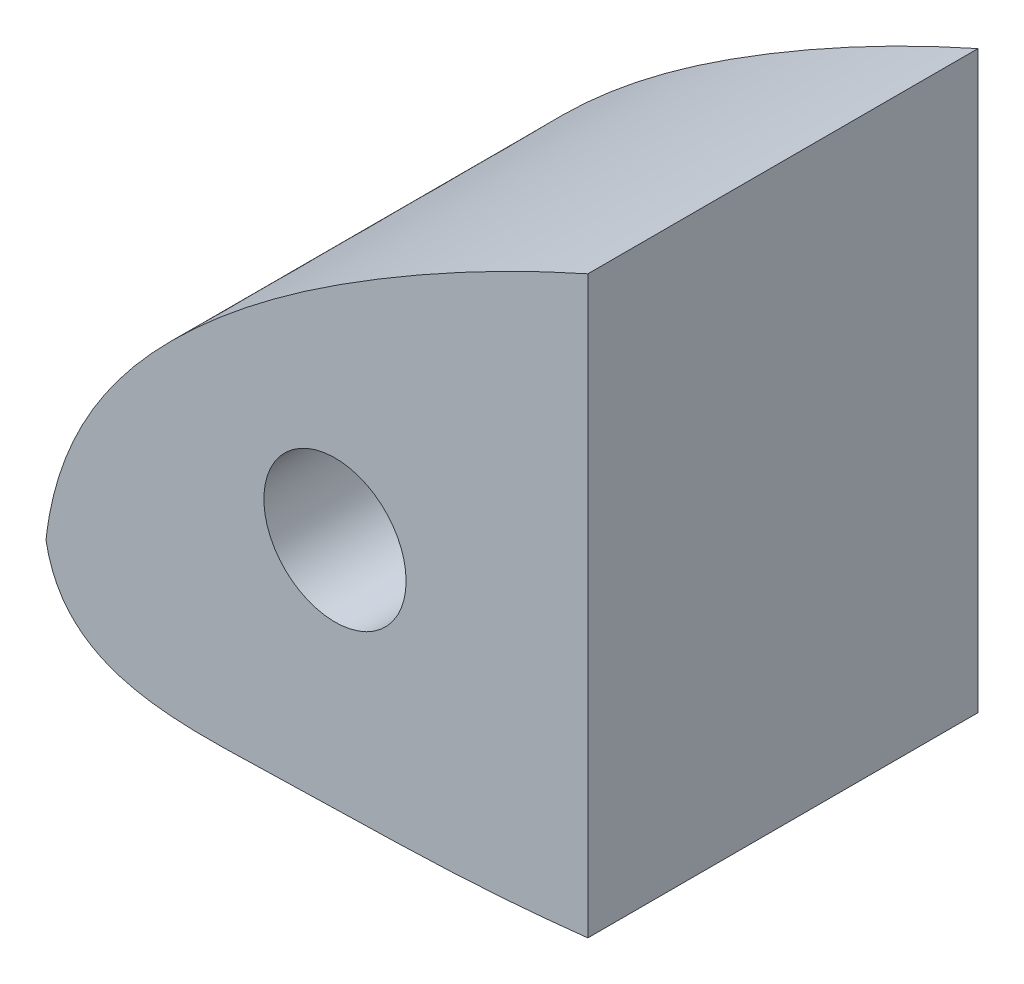
ISO-10303-21;
HEADER;
FILE_DESCRIPTION(('STEP AP214'),'2;1');
FILE_NAME('part.step','',(''),(''),'','','');
FILE_SCHEMA(('AUTOMOTIVE_DESIGN { 1 0 10303 214 1 1 1 1 }'));
ENDSEC;
DATA;
#1=APPLICATION_CONTEXT('core data for automotive mechanical design processes');
#2=APPLICATION_PROTOCOL_DEFINITION('international standard','automotive_design',2000,#1);
#3=PRODUCT_CONTEXT('',#1,'mechanical');
#4=PRODUCT('Part','Part','',(#3));
#5=PRODUCT_RELATED_PRODUCT_CATEGORY('part','',(#4));
#6=PRODUCT_DEFINITION_FORMATION('','',#4);
#7=PRODUCT_DEFINITION_CONTEXT('part definition',#1,'design');
#8=PRODUCT_DEFINITION('design','',#6,#7);
#9=PRODUCT_DEFINITION_SHAPE('','',#8);
#10=(LENGTH_UNIT() NAMED_UNIT(*) SI_UNIT(.MILLI.,.METRE.));
#11=(NAMED_UNIT(*) PLANE_ANGLE_UNIT() SI_UNIT($,.RADIAN.));
#12=(NAMED_UNIT(*) SI_UNIT($,.STERADIAN.) SOLID_ANGLE_UNIT());
#13=UNCERTAINTY_MEASURE_WITH_UNIT(LENGTH_MEASURE(1.E-05),#10,'distance_accuracy_value','');
#14=(GEOMETRIC_REPRESENTATION_CONTEXT(3) GLOBAL_UNCERTAINTY_ASSIGNED_CONTEXT((#13)) GLOBAL_UNIT_ASSIGNED_CONTEXT((#10,
#11,#12)) REPRESENTATION_CONTEXT('',''));
#15=CARTESIAN_POINT('',(0.,0.,0.));
#16=DIRECTION('',(0.,0.,1.));
#17=DIRECTION('',(1.,0.,0.));
#18=AXIS2_PLACEMENT_3D('',#15,#16,#17);
#19=CARTESIAN_POINT('',(0.000560351162113587,0.000130087070423624,27.432));
#20=CARTESIAN_POINT('',(1.23071418869678,-6.92407609127206,27.432));
#21=CARTESIAN_POINT('',(15.3166033306834,-6.18906584099094,27.432));
#22=CARTESIAN_POINT('',(36.4546728163185,-6.09849990105009,27.432));
#23=CARTESIAN_POINT('',(66.5061971849192,-0.586669106973501,27.432));
#24=CARTESIAN_POINT('',(110.497331171581,6.18149522271792,27.432));
#25=CARTESIAN_POINT('',(157.718638091679,9.03065014873911,27.432));
#26=CARTESIAN_POINT('',(205.10142463584,8.83808028186313,27.432));
#27=CARTESIAN_POINT('',(235.858814759408,7.87030619247826,27.432));
#28=CARTESIAN_POINT('',(260.846344817159,5.42741339404395,27.432));
#29=CARTESIAN_POINT('',(276.264022989737,4.51435670375389,27.432));
#30=CARTESIAN_POINT('',(293.989507544058,2.09398731346533,27.432));
#31=CARTESIAN_POINT('',(303.956832564589,1.47095520994628,27.432));
#32=CARTESIAN_POINT('',(309.846313894505,0.000130087070423666,27.432));
#33=B_SPLINE_CURVE_WITH_KNOTS('',3,(#19,#20,#21,#22,#23,#24,#25,#26,#27,#28,#29,#30,#31,#32),
.UNSPECIFIED.,.F.,.F.,(4,1,1,1,1,1,1,1,1,1,1,4),(0.,0.0569078595717698,0.106482711504673,
0.214488052979465,0.341297688349143,0.535095665520157,0.664680853556909,0.794660698192775,
0.828978881532905,0.904725108725214,0.942212919019968,1.),.UNSPECIFIED.);
#34=DIRECTION('',(0.,0.,-1.));
#35=VECTOR('',#34,1.);
#36=SURFACE_OF_LINEAR_EXTRUSION('',#33,#35);
#37=CARTESIAN_POINT('',(0.000560351162113587,0.000130087070423624,0.));
#38=CARTESIAN_POINT('',(1.23071418869678,-6.92407609127206,0.));
#39=CARTESIAN_POINT('',(15.3166033306834,-6.18906584099094,0.));
#40=CARTESIAN_POINT('',(36.4546728163185,-6.09849990105009,0.));
#41=CARTESIAN_POINT('',(66.5061971849192,-0.586669106973501,0.));
#42=CARTESIAN_POINT('',(110.497331171581,6.18149522271792,0.));
#43=CARTESIAN_POINT('',(157.718638091679,9.03065014873911,0.));
#44=CARTESIAN_POINT('',(205.10142463584,8.83808028186313,0.));
#45=CARTESIAN_POINT('',(235.858814759408,7.87030619247826,0.));
#46=CARTESIAN_POINT('',(260.846344817159,5.42741339404395,0.));
#47=CARTESIAN_POINT('',(276.264022989737,4.51435670375389,0.));
#48=CARTESIAN_POINT('',(293.989507544058,2.09398731346533,0.));
#49=CARTESIAN_POINT('',(303.956832564589,1.47095520994628,0.));
#50=CARTESIAN_POINT('',(309.846313894505,0.000130087070423666,0.));
#51=B_SPLINE_CURVE_WITH_KNOTS('',3,(#37,#38,#39,#40,#41,#42,#43,#44,#45,#46,#47,#48,#49,#50),
.UNSPECIFIED.,.F.,.F.,(4,1,1,1,1,1,1,1,1,1,1,4),(0.,0.0569078595717698,0.106482711504673,
0.214488052979465,0.341297688349143,0.535095665520157,0.664680853556909,0.794660698192775,
0.828978881532905,0.904725108725214,0.942212919019968,1.),.UNSPECIFIED.);
#52=CARTESIAN_POINT('',(0.000560351162116727,0.000130087070423829,0.));
#53=VERTEX_POINT('',#52);
#54=CARTESIAN_POINT('',(38.0999999979874,-5.18097252426853,0.));
#55=VERTEX_POINT('',#54);
#56=EDGE_CURVE('E100',#53,#55,#51,.T.);
#57=ORIENTED_EDGE('',*,*,#56,.T.);
#58=DIRECTION('',(0.,0.,-1.));
#59=VECTOR('',#58,1.);
#60=CARTESIAN_POINT('',(38.1,-5.18097252404465,27.432));
#61=LINE('',#60,#59);
#62=CARTESIAN_POINT('',(38.1,-5.18097252426854,27.432));
#63=VERTEX_POINT('',#62);
#64=EDGE_CURVE('E55',#55,#63,#61,.F.);
#65=ORIENTED_EDGE('',*,*,#64,.T.);
#66=CARTESIAN_POINT('',(0.000560351162116727,0.000130087070423829,27.432));
#67=VERTEX_POINT('',#66);
#68=EDGE_CURVE('E84',#67,#63,#33,.T.);
#69=ORIENTED_EDGE('',*,*,#68,.F.);
#70=DIRECTION('',(0.,0.,-1.));
#71=VECTOR('',#70,1.);
#72=CARTESIAN_POINT('',(0.000560351162116727,0.000130087070423829,27.432));
#73=LINE('',#72,#71);
#74=EDGE_CURVE('E11',#67,#53,#73,.T.);
#75=ORIENTED_EDGE('',*,*,#74,.T.);
#76=EDGE_LOOP('',(#57,#65,#69,#75));
#77=FACE_BOUND('',#76,.T.);
#78=ADVANCED_FACE('F39',(#77),#36,.F.);
#79=CARTESIAN_POINT('',(309.846313894505,0.000130087070423864,27.432));
#80=CARTESIAN_POINT('',(314.816918223261,-0.51620674157964,27.432));
#81=CARTESIAN_POINT('',(301.273197720551,4.38282813873556,27.432));
#82=CARTESIAN_POINT('',(290.359837670022,8.71099439045776,27.432));
#83=CARTESIAN_POINT('',(256.952064400645,19.5289209482833,27.432));
#84=CARTESIAN_POINT('',(217.961060472083,29.6129748944238,27.432));
#85=CARTESIAN_POINT('',(173.256699242147,40.0411042779434,27.432));
#86=CARTESIAN_POINT('',(131.400792108858,47.8848319151037,27.432));
#87=CARTESIAN_POINT('',(89.5976184754884,49.290763053775,27.432));
#88=CARTESIAN_POINT('',(52.1111282710831,42.0692152748914,27.432));
#89=CARTESIAN_POINT('',(26.2867198183782,29.9751763284633,27.432));
#90=CARTESIAN_POINT('',(8.64909202481883,17.8566051741579,27.432));
#91=CARTESIAN_POINT('',(0.810633126632263,7.35919605469637,27.432));
#92=CARTESIAN_POINT('',(0.000560351162116727,0.000130087070423829,27.432));
#93=B_SPLINE_CURVE_WITH_KNOTS('',3,(#79,#80,#81,#82,#83,#84,#85,#86,#87,#88,#89,#90,#91,#92),
.UNSPECIFIED.,.F.,.F.,(4,1,1,1,1,1,1,1,1,1,1,4),(0.,0.0239417713693992,0.070244030177139,
0.147561721425381,0.308455887006792,0.442387865106874,0.551517565626309,0.687091076796298,
0.811391258419108,0.886311735305172,0.939136382225768,1.),.UNSPECIFIED.);
#94=DIRECTION('',(0.,0.,-1.));
#95=VECTOR('',#94,1.);
#96=SURFACE_OF_LINEAR_EXTRUSION('',#93,#95);
#97=CARTESIAN_POINT('',(38.1,35.2581330206231,27.432));
#98=VERTEX_POINT('',#97);
#99=EDGE_CURVE('E48',#98,#67,#93,.T.);
#100=ORIENTED_EDGE('',*,*,#99,.F.);
#101=DIRECTION('',(0.,0.,-1.));
#102=VECTOR('',#101,1.);
#103=CARTESIAN_POINT('',(38.1,35.2581330224171,27.432));
#104=LINE('',#103,#102);
#105=CARTESIAN_POINT('',(38.1,35.2581330206231,0.));
#106=VERTEX_POINT('',#105);
#107=EDGE_CURVE('E74',#98,#106,#104,.T.);
#108=ORIENTED_EDGE('',*,*,#107,.T.);
#109=CARTESIAN_POINT('',(309.846313894505,0.000130087070423864,0.));
#110=CARTESIAN_POINT('',(314.816918223261,-0.51620674157964,0.));
#111=CARTESIAN_POINT('',(301.273197720551,4.38282813873556,0.));
#112=CARTESIAN_POINT('',(290.359837670022,8.71099439045776,0.));
#113=CARTESIAN_POINT('',(256.952064400645,19.5289209482833,0.));
#114=CARTESIAN_POINT('',(217.961060472083,29.6129748944238,0.));
#115=CARTESIAN_POINT('',(173.256699242147,40.0411042779434,0.));
#116=CARTESIAN_POINT('',(131.400792108858,47.8848319151037,0.));
#117=CARTESIAN_POINT('',(89.5976184754884,49.290763053775,0.));
#118=CARTESIAN_POINT('',(52.1111282710831,42.0692152748914,0.));
#119=CARTESIAN_POINT('',(26.2867198183782,29.9751763284633,0.));
#120=CARTESIAN_POINT('',(8.64909202481883,17.8566051741579,0.));
#121=CARTESIAN_POINT('',(0.810633126632263,7.35919605469637,0.));
#122=CARTESIAN_POINT('',(0.000560351162116727,0.000130087070423829,0.));
#123=B_SPLINE_CURVE_WITH_KNOTS('',3,(#109,#110,#111,#112,#113,#114,#115,#116,#117,#118,#119,
#120,#121,#122),.UNSPECIFIED.,.F.,.F.,(4,1,1,1,1,1,1,1,1,1,1,4),(0.,0.0239417713693992,
0.070244030177139,0.147561721425381,0.308455887006792,0.442387865106874,0.551517565626309,
0.687091076796298,0.811391258419108,0.886311735305172,0.939136382225768,1.),.UNSPECIFIED.);
#124=EDGE_CURVE('E91',#106,#53,#123,.T.);
#125=ORIENTED_EDGE('',*,*,#124,.T.);
#126=ORIENTED_EDGE('',*,*,#74,.F.);
#127=EDGE_LOOP('',(#100,#108,#125,#126));
#128=FACE_BOUND('',#127,.T.);
#129=ADVANCED_FACE('F87',(#128),#96,.F.);
#130=CARTESIAN_POINT('',(153.387816973495,8.33338198857885,27.432));
#131=DIRECTION('',(0.,0.,-1.));
#132=DIRECTION('',(-1.,0.,0.));
#133=AXIS2_PLACEMENT_3D('',#130,#131,#132);
#134=PLANE('',#133);
#135=CARTESIAN_POINT('',(20.32,10.16,27.432));
#136=DIRECTION('',(0.,0.,1.));
#137=DIRECTION('',(1.,0.,0.));
#138=AXIS2_PLACEMENT_3D('',#135,#136,#137);
#139=CIRCLE('',#138,5.);
#140=CARTESIAN_POINT('',(25.32,10.16,27.432));
#141=VERTEX_POINT('',#140);
#142=EDGE_CURVE('E133',#141,#141,#139,.T.);
#143=ORIENTED_EDGE('',*,*,#142,.F.);
#144=EDGE_LOOP('',(#143));
#145=FACE_BOUND('',#144,.T.);
#146=ORIENTED_EDGE('',*,*,#68,.T.);
#147=DIRECTION('',(0.,-1.,0.));
#148=VECTOR('',#147,1.);
#149=CARTESIAN_POINT('',(38.1,71.7179988353335,27.432));
#150=LINE('',#149,#148);
#151=EDGE_CURVE('E76',#98,#63,#150,.T.);
#152=ORIENTED_EDGE('',*,*,#151,.F.);
#153=ORIENTED_EDGE('',*,*,#99,.T.);
#154=EDGE_LOOP('',(#146,#152,#153));
#155=FACE_BOUND('',#154,.T.);
#156=ADVANCED_FACE('F82',(#145,#155),#134,.F.);
#157=CARTESIAN_POINT('',(153.387816973495,8.33338198857885,0.));
#158=DIRECTION('',(0.,0.,-1.));
#159=DIRECTION('',(-1.,0.,0.));
#160=AXIS2_PLACEMENT_3D('',#157,#158,#159);
#161=PLANE('',#160);
#162=DIRECTION('',(0.,-1.,0.));
#163=VECTOR('',#162,1.);
#164=CARTESIAN_POINT('',(38.1,71.7179988353335,0.));
#165=LINE('',#164,#163);
#166=EDGE_CURVE('E77',#106,#55,#165,.T.);
#167=ORIENTED_EDGE('',*,*,#166,.T.);
#168=ORIENTED_EDGE('',*,*,#56,.F.);
#169=ORIENTED_EDGE('',*,*,#124,.F.);
#170=EDGE_LOOP('',(#167,#168,#169));
#171=FACE_BOUND('',#170,.T.);
#172=CARTESIAN_POINT('',(20.32,10.16,0.));
#173=DIRECTION('',(0.,0.,1.));
#174=DIRECTION('',(1.,0.,0.));
#175=AXIS2_PLACEMENT_3D('',#172,#173,#174);
#176=CIRCLE('',#175,5.);
#177=CARTESIAN_POINT('',(25.32,10.16,0.));
#178=VERTEX_POINT('',#177);
#179=EDGE_CURVE('E129',#178,#178,#176,.T.);
#180=ORIENTED_EDGE('',*,*,#179,.T.);
#181=EDGE_LOOP('',(#180));
#182=FACE_BOUND('',#181,.T.);
#183=ADVANCED_FACE('F108',(#171,#182),#161,.T.);
#184=CARTESIAN_POINT('',(20.32,10.16,0.));
#185=DIRECTION('',(0.,0.,1.));
#186=DIRECTION('',(1.,0.,0.));
#187=AXIS2_PLACEMENT_3D('',#184,#185,#186);
#188=CYLINDRICAL_SURFACE('',#187,5.);
#189=ORIENTED_EDGE('',*,*,#179,.F.);
#190=EDGE_LOOP('',(#189));
#191=FACE_BOUND('',#190,.T.);
#192=ORIENTED_EDGE('',*,*,#142,.T.);
#193=EDGE_LOOP('',(#192));
#194=FACE_BOUND('',#193,.T.);
#195=ADVANCED_FACE('F111',(#191,#194),#188,.F.);
#196=CARTESIAN_POINT('',(38.1,71.7179988353335,0.));
#197=DIRECTION('',(-1.,0.,0.));
#198=DIRECTION('',(0.,-1.,0.));
#199=AXIS2_PLACEMENT_3D('',#196,#197,#198);
#200=PLANE('',#199);
#201=ORIENTED_EDGE('',*,*,#166,.F.);
#202=ORIENTED_EDGE('',*,*,#107,.F.);
#203=ORIENTED_EDGE('',*,*,#151,.T.);
#204=ORIENTED_EDGE('',*,*,#64,.F.);
#205=EDGE_LOOP('',(#201,#202,#203,#204));
#206=FACE_BOUND('',#205,.T.);
#207=ADVANCED_FACE('F75',(#206),#200,.F.);
#208=CLOSED_SHELL('',(#78,#129,#156,#183,#195,#207));
#209=MANIFOLD_SOLID_BREP('B2',#208);
#210=ADVANCED_BREP_SHAPE_REPRESENTATION('',(#18,#209),#14);
#211=SHAPE_DEFINITION_REPRESENTATION(#9,#210);
ENDSEC;
END-ISO-10303-21;
